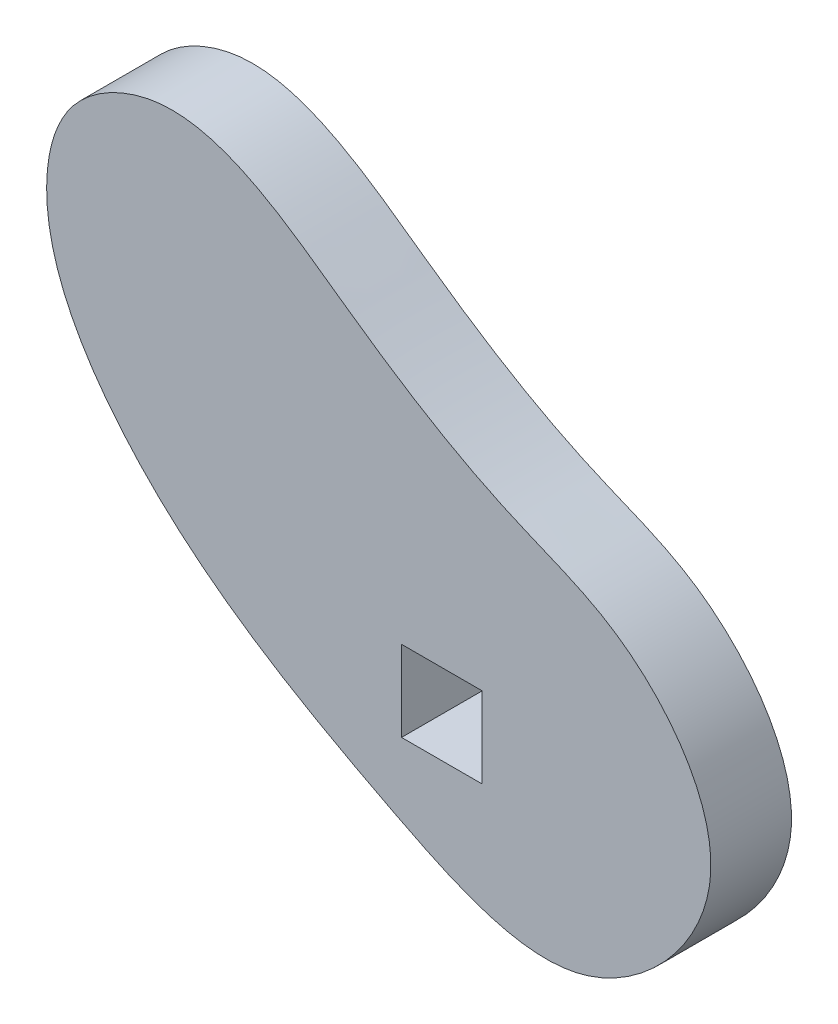
ISO-10303-21;
HEADER;
FILE_DESCRIPTION(('STEP AP214'),'2;1');
FILE_NAME('part.step','',(''),(''),'','','');
FILE_SCHEMA(('AUTOMOTIVE_DESIGN { 1 0 10303 214 1 1 1 1 }'));
ENDSEC;
DATA;
#1=APPLICATION_CONTEXT('core data for automotive mechanical design processes');
#2=APPLICATION_PROTOCOL_DEFINITION('international standard','automotive_design',2000,#1);
#3=PRODUCT_CONTEXT('',#1,'mechanical');
#4=PRODUCT('Part','Part','',(#3));
#5=PRODUCT_RELATED_PRODUCT_CATEGORY('part','',(#4));
#6=PRODUCT_DEFINITION_FORMATION('','',#4);
#7=PRODUCT_DEFINITION_CONTEXT('part definition',#1,'design');
#8=PRODUCT_DEFINITION('design','',#6,#7);
#9=PRODUCT_DEFINITION_SHAPE('','',#8);
#10=(LENGTH_UNIT() NAMED_UNIT(*) SI_UNIT(.MILLI.,.METRE.));
#11=(NAMED_UNIT(*) PLANE_ANGLE_UNIT() SI_UNIT($,.RADIAN.));
#12=(NAMED_UNIT(*) SI_UNIT($,.STERADIAN.) SOLID_ANGLE_UNIT());
#13=UNCERTAINTY_MEASURE_WITH_UNIT(LENGTH_MEASURE(1.E-05),#10,'distance_accuracy_value','');
#14=(GEOMETRIC_REPRESENTATION_CONTEXT(3) GLOBAL_UNCERTAINTY_ASSIGNED_CONTEXT((#13)) GLOBAL_UNIT_ASSIGNED_CONTEXT((#10,
#11,#12)) REPRESENTATION_CONTEXT('',''));
#15=CARTESIAN_POINT('',(0.,0.,0.));
#16=DIRECTION('',(0.,0.,1.));
#17=DIRECTION('',(1.,0.,0.));
#18=AXIS2_PLACEMENT_3D('',#15,#16,#17);
#19=CARTESIAN_POINT('',(-0.480200019949076,54.7763813563239,1.524));
#20=DIRECTION('',(0.,0.,1.));
#21=DIRECTION('',(1.,0.,0.));
#22=AXIS2_PLACEMENT_3D('',#19,#20,#21);
#23=PLANE('',#22);
#24=CARTESIAN_POINT('',(0.66090828503938,46.7855583084045,1.524));
#25=CARTESIAN_POINT('',(1.81242868396393,46.1940204363143,1.524));
#26=CARTESIAN_POINT('',(4.29009208433679,45.0050339171217,1.524));
#27=CARTESIAN_POINT('',(7.64108954115115,48.7179841470165,1.524));
#28=CARTESIAN_POINT('',(5.3403979709721,51.8373631482002,1.524));
#29=CARTESIAN_POINT('',(2.43824499680313,52.847713917336,1.524));
#30=CARTESIAN_POINT('',(-0.236346841389418,54.5007097986006,1.524));
#31=CARTESIAN_POINT('',(-3.10092545838978,56.7940623031701,1.524));
#32=CARTESIAN_POINT('',(-5.72397472635546,55.4222027909795,1.524));
#33=CARTESIAN_POINT('',(-6.15539205647174,52.8979011421433,1.524));
#34=CARTESIAN_POINT('',(-4.03835663583325,49.3892411899722,1.524));
#35=CARTESIAN_POINT('',(-1.3465345422688,47.8167849019738,1.524));
#36=CARTESIAN_POINT('',(0.66090828503938,46.7855583084045,1.524));
#37=B_SPLINE_CURVE_WITH_KNOTS('',3,(#24,#25,#26,#27,#28,#29,#30,#31,#32,#33,#34,#35,#36),
.UNSPECIFIED.,.T.,.F.,(4,1,1,1,1,1,1,1,1,1,4),(0.,0.107360478705634,0.21725599845795,
0.32278938768209,0.382476314549363,0.489415094246727,0.608750307502248,0.660878276983896,
0.717918676767846,0.812838727724422,1.),.UNSPECIFIED.);
#38=CARTESIAN_POINT('',(0.66090828503938,46.7855583084045,1.524));
#39=VERTEX_POINT('',#38);
#40=EDGE_CURVE('E11',#39,#39,#37,.T.);
#41=ORIENTED_EDGE('',*,*,#40,.T.);
#42=EDGE_LOOP('',(#41));
#43=FACE_BOUND('',#42,.T.);
#44=DIRECTION('',(0.,-1.,0.));
#45=VECTOR('',#44,1.);
#46=CARTESIAN_POINT('',(0.796185960450596,49.6156784841767,1.524));
#47=LINE('',#46,#45);
#48=CARTESIAN_POINT('',(0.796185960450596,49.6156784841767,1.524));
#49=VERTEX_POINT('',#48);
#50=CARTESIAN_POINT('',(0.796185960450595,48.0916784841767,1.524));
#51=VERTEX_POINT('',#50);
#52=EDGE_CURVE('E82',#49,#51,#47,.T.);
#53=ORIENTED_EDGE('',*,*,#52,.F.);
#54=DIRECTION('',(-1.,0.,0.));
#55=VECTOR('',#54,1.);
#56=CARTESIAN_POINT('',(2.3201859604506,49.6156784841767,1.524));
#57=LINE('',#56,#55);
#58=CARTESIAN_POINT('',(2.3201859604506,49.6156784841767,1.524));
#59=VERTEX_POINT('',#58);
#60=EDGE_CURVE('E74',#59,#49,#57,.T.);
#61=ORIENTED_EDGE('',*,*,#60,.F.);
#62=DIRECTION('',(0.,1.,0.));
#63=VECTOR('',#62,1.);
#64=CARTESIAN_POINT('',(2.3201859604506,48.0916784841767,1.524));
#65=LINE('',#64,#63);
#66=CARTESIAN_POINT('',(2.3201859604506,48.0916784841767,1.524));
#67=VERTEX_POINT('',#66);
#68=EDGE_CURVE('E95',#67,#59,#65,.T.);
#69=ORIENTED_EDGE('',*,*,#68,.F.);
#70=DIRECTION('',(1.,0.,0.));
#71=VECTOR('',#70,1.);
#72=CARTESIAN_POINT('',(0.796185960450595,48.0916784841767,1.524));
#73=LINE('',#72,#71);
#74=EDGE_CURVE('E93',#51,#67,#73,.T.);
#75=ORIENTED_EDGE('',*,*,#74,.F.);
#76=EDGE_LOOP('',(#53,#61,#69,#75));
#77=FACE_BOUND('',#76,.T.);
#78=ADVANCED_FACE('F31',(#43,#77),#23,.T.);
#79=CARTESIAN_POINT('',(-0.480200019949076,54.7763813563239,0.));
#80=DIRECTION('',(0.,0.,1.));
#81=DIRECTION('',(1.,0.,0.));
#82=AXIS2_PLACEMENT_3D('',#79,#80,#81);
#83=PLANE('',#82);
#84=CARTESIAN_POINT('',(0.66090828503938,46.7855583084045,0.));
#85=CARTESIAN_POINT('',(1.81242868396393,46.1940204363143,0.));
#86=CARTESIAN_POINT('',(4.29009208433679,45.0050339171217,0.));
#87=CARTESIAN_POINT('',(7.64108954115115,48.7179841470165,0.));
#88=CARTESIAN_POINT('',(5.3403979709721,51.8373631482002,0.));
#89=CARTESIAN_POINT('',(2.43824499680313,52.847713917336,0.));
#90=CARTESIAN_POINT('',(-0.236346841389418,54.5007097986006,0.));
#91=CARTESIAN_POINT('',(-3.10092545838978,56.7940623031701,0.));
#92=CARTESIAN_POINT('',(-5.72397472635546,55.4222027909795,0.));
#93=CARTESIAN_POINT('',(-6.15539205647174,52.8979011421433,0.));
#94=CARTESIAN_POINT('',(-4.03835663583325,49.3892411899722,0.));
#95=CARTESIAN_POINT('',(-1.3465345422688,47.8167849019738,0.));
#96=CARTESIAN_POINT('',(0.66090828503938,46.7855583084045,0.));
#97=B_SPLINE_CURVE_WITH_KNOTS('',3,(#84,#85,#86,#87,#88,#89,#90,#91,#92,#93,#94,#95,#96),
.UNSPECIFIED.,.T.,.F.,(4,1,1,1,1,1,1,1,1,1,4),(0.,0.107360478705634,0.21725599845795,
0.32278938768209,0.382476314549363,0.489415094246727,0.608750307502248,0.660878276983896,
0.717918676767846,0.812838727724422,1.),.UNSPECIFIED.);
#98=CARTESIAN_POINT('',(0.66090828503938,46.7855583084045,0.));
#99=VERTEX_POINT('',#98);
#100=EDGE_CURVE('E36',#99,#99,#97,.T.);
#101=ORIENTED_EDGE('',*,*,#100,.F.);
#102=EDGE_LOOP('',(#101));
#103=FACE_BOUND('',#102,.T.);
#104=DIRECTION('',(-1.,0.,0.));
#105=VECTOR('',#104,1.);
#106=CARTESIAN_POINT('',(2.3201859604506,49.6156784841767,0.));
#107=LINE('',#106,#105);
#108=CARTESIAN_POINT('',(2.3201859604506,49.6156784841767,0.));
#109=VERTEX_POINT('',#108);
#110=CARTESIAN_POINT('',(0.796185960450596,49.6156784841767,0.));
#111=VERTEX_POINT('',#110);
#112=EDGE_CURVE('E56',#109,#111,#107,.T.);
#113=ORIENTED_EDGE('',*,*,#112,.T.);
#114=DIRECTION('',(0.,-1.,0.));
#115=VECTOR('',#114,1.);
#116=CARTESIAN_POINT('',(0.796185960450596,49.6156784841767,0.));
#117=LINE('',#116,#115);
#118=CARTESIAN_POINT('',(0.796185960450595,48.0916784841767,0.));
#119=VERTEX_POINT('',#118);
#120=EDGE_CURVE('E89',#111,#119,#117,.T.);
#121=ORIENTED_EDGE('',*,*,#120,.T.);
#122=DIRECTION('',(1.,0.,0.));
#123=VECTOR('',#122,1.);
#124=CARTESIAN_POINT('',(0.796185960450595,48.0916784841767,0.));
#125=LINE('',#124,#123);
#126=CARTESIAN_POINT('',(2.3201859604506,48.0916784841767,0.));
#127=VERTEX_POINT('',#126);
#128=EDGE_CURVE('E101',#119,#127,#125,.T.);
#129=ORIENTED_EDGE('',*,*,#128,.T.);
#130=DIRECTION('',(0.,1.,0.));
#131=VECTOR('',#130,1.);
#132=CARTESIAN_POINT('',(2.3201859604506,48.0916784841767,0.));
#133=LINE('',#132,#131);
#134=EDGE_CURVE('E83',#127,#109,#133,.T.);
#135=ORIENTED_EDGE('',*,*,#134,.T.);
#136=EDGE_LOOP('',(#113,#121,#129,#135));
#137=FACE_BOUND('',#136,.T.);
#138=ADVANCED_FACE('F118',(#103,#137),#83,.F.);
#139=DIRECTION('',(0.,0.,-1.));
#140=VECTOR('',#139,1.);
#141=SURFACE_OF_LINEAR_EXTRUSION('',#37,#140);
#142=ORIENTED_EDGE('',*,*,#40,.F.);
#143=EDGE_LOOP('',(#142));
#144=FACE_BOUND('',#143,.T.);
#145=ORIENTED_EDGE('',*,*,#100,.T.);
#146=EDGE_LOOP('',(#145));
#147=FACE_BOUND('',#146,.T.);
#148=ADVANCED_FACE('F33',(#144,#147),#141,.F.);
#149=CARTESIAN_POINT('',(2.3201859604506,49.6156784841767,1.524));
#150=DIRECTION('',(0.,-1.,0.));
#151=DIRECTION('',(0.,0.,-1.));
#152=AXIS2_PLACEMENT_3D('',#149,#150,#151);
#153=PLANE('',#152);
#154=ORIENTED_EDGE('',*,*,#112,.F.);
#155=DIRECTION('',(0.,0.,-1.));
#156=VECTOR('',#155,1.);
#157=CARTESIAN_POINT('',(2.3201859604506,49.6156784841767,1.524));
#158=LINE('',#157,#156);
#159=EDGE_CURVE('E78',#59,#109,#158,.T.);
#160=ORIENTED_EDGE('',*,*,#159,.F.);
#161=ORIENTED_EDGE('',*,*,#60,.T.);
#162=DIRECTION('',(0.,0.,-1.));
#163=VECTOR('',#162,1.);
#164=CARTESIAN_POINT('',(0.796185960450596,49.6156784841767,1.524));
#165=LINE('',#164,#163);
#166=EDGE_CURVE('E77',#49,#111,#165,.T.);
#167=ORIENTED_EDGE('',*,*,#166,.T.);
#168=EDGE_LOOP('',(#154,#160,#161,#167));
#169=FACE_BOUND('',#168,.T.);
#170=ADVANCED_FACE('F76',(#169),#153,.T.);
#171=CARTESIAN_POINT('',(0.796185960450596,49.6156784841767,1.524));
#172=DIRECTION('',(1.,0.,0.));
#173=DIRECTION('',(0.,1.,0.));
#174=AXIS2_PLACEMENT_3D('',#171,#172,#173);
#175=PLANE('',#174);
#176=ORIENTED_EDGE('',*,*,#120,.F.);
#177=ORIENTED_EDGE('',*,*,#166,.F.);
#178=ORIENTED_EDGE('',*,*,#52,.T.);
#179=DIRECTION('',(0.,0.,-1.));
#180=VECTOR('',#179,1.);
#181=CARTESIAN_POINT('',(0.796185960450595,48.0916784841767,1.524));
#182=LINE('',#181,#180);
#183=EDGE_CURVE('E90',#51,#119,#182,.T.);
#184=ORIENTED_EDGE('',*,*,#183,.T.);
#185=EDGE_LOOP('',(#176,#177,#178,#184));
#186=FACE_BOUND('',#185,.T.);
#187=ADVANCED_FACE('F86',(#186),#175,.T.);
#188=CARTESIAN_POINT('',(0.796185960450595,48.0916784841767,1.524));
#189=DIRECTION('',(0.,1.,0.));
#190=DIRECTION('',(0.,0.,1.));
#191=AXIS2_PLACEMENT_3D('',#188,#189,#190);
#192=PLANE('',#191);
#193=ORIENTED_EDGE('',*,*,#128,.F.);
#194=ORIENTED_EDGE('',*,*,#183,.F.);
#195=ORIENTED_EDGE('',*,*,#74,.T.);
#196=DIRECTION('',(0.,0.,-1.));
#197=VECTOR('',#196,1.);
#198=CARTESIAN_POINT('',(2.3201859604506,48.0916784841767,1.524));
#199=LINE('',#198,#197);
#200=EDGE_CURVE('E48',#67,#127,#199,.T.);
#201=ORIENTED_EDGE('',*,*,#200,.T.);
#202=EDGE_LOOP('',(#193,#194,#195,#201));
#203=FACE_BOUND('',#202,.T.);
#204=ADVANCED_FACE('F116',(#203),#192,.T.);
#205=CARTESIAN_POINT('',(2.3201859604506,48.0916784841767,1.524));
#206=DIRECTION('',(-1.,0.,0.));
#207=DIRECTION('',(0.,-1.,0.));
#208=AXIS2_PLACEMENT_3D('',#205,#206,#207);
#209=PLANE('',#208);
#210=ORIENTED_EDGE('',*,*,#134,.F.);
#211=ORIENTED_EDGE('',*,*,#200,.F.);
#212=ORIENTED_EDGE('',*,*,#68,.T.);
#213=ORIENTED_EDGE('',*,*,#159,.T.);
#214=EDGE_LOOP('',(#210,#211,#212,#213));
#215=FACE_BOUND('',#214,.T.);
#216=ADVANCED_FACE('F119',(#215),#209,.T.);
#217=CLOSED_SHELL('',(#78,#138,#148,#170,#187,#204,#216));
#218=MANIFOLD_SOLID_BREP('B2',#217);
#219=ADVANCED_BREP_SHAPE_REPRESENTATION('',(#18,#218),#14);
#220=SHAPE_DEFINITION_REPRESENTATION(#9,#219);
ENDSEC;
END-ISO-10303-21;
